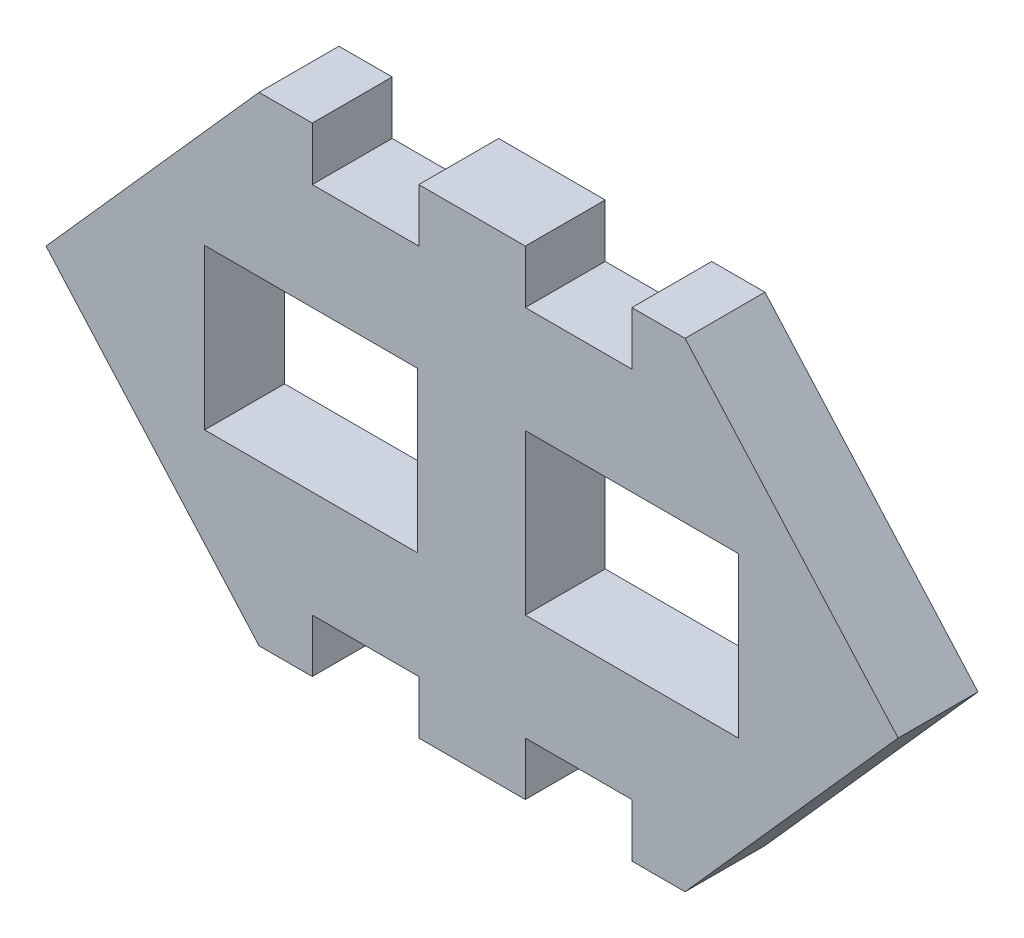
ISO-10303-21;
HEADER;
FILE_DESCRIPTION(('STEP AP214'),'2;1');
FILE_NAME('part.step','',(''),(''),'','','');
FILE_SCHEMA(('AUTOMOTIVE_DESIGN { 1 0 10303 214 1 1 1 1 }'));
ENDSEC;
DATA;
#1=APPLICATION_CONTEXT('core data for automotive mechanical design processes');
#2=APPLICATION_PROTOCOL_DEFINITION('international standard','automotive_design',2000,#1);
#3=PRODUCT_CONTEXT('',#1,'mechanical');
#4=PRODUCT('Part','Part','',(#3));
#5=PRODUCT_RELATED_PRODUCT_CATEGORY('part','',(#4));
#6=PRODUCT_DEFINITION_FORMATION('','',#4);
#7=PRODUCT_DEFINITION_CONTEXT('part definition',#1,'design');
#8=PRODUCT_DEFINITION('design','',#6,#7);
#9=PRODUCT_DEFINITION_SHAPE('','',#8);
#10=(LENGTH_UNIT() NAMED_UNIT(*) SI_UNIT(.MILLI.,.METRE.));
#11=(NAMED_UNIT(*) PLANE_ANGLE_UNIT() SI_UNIT($,.RADIAN.));
#12=(NAMED_UNIT(*) SI_UNIT($,.STERADIAN.) SOLID_ANGLE_UNIT());
#13=UNCERTAINTY_MEASURE_WITH_UNIT(LENGTH_MEASURE(1.E-05),#10,'distance_accuracy_value','');
#14=(GEOMETRIC_REPRESENTATION_CONTEXT(3) GLOBAL_UNCERTAINTY_ASSIGNED_CONTEXT((#13)) GLOBAL_UNIT_ASSIGNED_CONTEXT((#10,
#11,#12)) REPRESENTATION_CONTEXT('',''));
#15=CARTESIAN_POINT('',(0.,0.,0.));
#16=DIRECTION('',(0.,0.,1.));
#17=DIRECTION('',(1.,0.,0.));
#18=AXIS2_PLACEMENT_3D('',#15,#16,#17);
#19=CARTESIAN_POINT('',(0.,0.,38.1));
#20=DIRECTION('',(0.,0.,-1.));
#21=DIRECTION('',(-1.,0.,0.));
#22=AXIS2_PLACEMENT_3D('',#19,#20,#21);
#23=PLANE('',#22);
#24=DIRECTION('',(0.,-1.,0.));
#25=VECTOR('',#24,1.);
#26=CARTESIAN_POINT('',(228.6,38.1,38.1));
#27=LINE('',#26,#25);
#28=CARTESIAN_POINT('',(228.6,38.1,38.1));
#29=VERTEX_POINT('',#28);
#30=CARTESIAN_POINT('',(228.6,-38.1,38.1));
#31=VERTEX_POINT('',#30);
#32=EDGE_CURVE('E285',#29,#31,#27,.T.);
#33=ORIENTED_EDGE('',*,*,#32,.F.);
#34=DIRECTION('',(-1.,0.,0.));
#35=VECTOR('',#34,1.);
#36=CARTESIAN_POINT('',(228.6,38.1,38.1));
#37=LINE('',#36,#35);
#38=CARTESIAN_POINT('',(330.2,38.1,38.1));
#39=VERTEX_POINT('',#38);
#40=EDGE_CURVE('E296',#39,#29,#37,.T.);
#41=ORIENTED_EDGE('',*,*,#40,.F.);
#42=DIRECTION('',(0.,1.,0.));
#43=VECTOR('',#42,1.);
#44=CARTESIAN_POINT('',(330.2,38.1,38.1));
#45=LINE('',#44,#43);
#46=CARTESIAN_POINT('',(330.2,-38.1,38.1));
#47=VERTEX_POINT('',#46);
#48=EDGE_CURVE('E292',#47,#39,#45,.T.);
#49=ORIENTED_EDGE('',*,*,#48,.F.);
#50=DIRECTION('',(1.,0.,0.));
#51=VECTOR('',#50,1.);
#52=CARTESIAN_POINT('',(228.6,-38.1,38.1));
#53=LINE('',#52,#51);
#54=EDGE_CURVE('E288',#31,#47,#53,.T.);
#55=ORIENTED_EDGE('',*,*,#54,.F.);
#56=EDGE_LOOP('',(#33,#41,#49,#55));
#57=FACE_BOUND('',#56,.T.);
#58=DIRECTION('',(0.66436383882992,-0.74740931868366,0.));
#59=VECTOR('',#58,1.);
#60=CARTESIAN_POINT('',(101.6,-114.3,38.1));
#61=LINE('',#60,#59);
#62=CARTESIAN_POINT('',(0.,0.,38.1));
#63=VERTEX_POINT('',#62);
#64=CARTESIAN_POINT('',(101.6,-114.3,38.1));
#65=VERTEX_POINT('',#64);
#66=EDGE_CURVE('E328',#63,#65,#61,.T.);
#67=ORIENTED_EDGE('',*,*,#66,.T.);
#68=DIRECTION('',(1.,0.,0.));
#69=VECTOR('',#68,1.);
#70=CARTESIAN_POINT('',(127.,-114.3,38.1));
#71=LINE('',#70,#69);
#72=CARTESIAN_POINT('',(127.,-114.3,38.1));
#73=VERTEX_POINT('',#72);
#74=EDGE_CURVE('E332',#65,#73,#71,.T.);
#75=ORIENTED_EDGE('',*,*,#74,.T.);
#76=DIRECTION('',(0.,1.,0.));
#77=VECTOR('',#76,1.);
#78=CARTESIAN_POINT('',(127.,-88.9,38.1));
#79=LINE('',#78,#77);
#80=CARTESIAN_POINT('',(127.,-88.9,38.1));
#81=VERTEX_POINT('',#80);
#82=EDGE_CURVE('E336',#73,#81,#79,.T.);
#83=ORIENTED_EDGE('',*,*,#82,.T.);
#84=DIRECTION('',(1.,0.,0.));
#85=VECTOR('',#84,1.);
#86=CARTESIAN_POINT('',(177.8,-88.9,38.1));
#87=LINE('',#86,#85);
#88=CARTESIAN_POINT('',(177.8,-88.9,38.1));
#89=VERTEX_POINT('',#88);
#90=EDGE_CURVE('E339',#81,#89,#87,.T.);
#91=ORIENTED_EDGE('',*,*,#90,.T.);
#92=DIRECTION('',(0.,-1.,0.));
#93=VECTOR('',#92,1.);
#94=CARTESIAN_POINT('',(177.8,-114.3,38.1));
#95=LINE('',#94,#93);
#96=CARTESIAN_POINT('',(177.8,-114.3,38.1));
#97=VERTEX_POINT('',#96);
#98=EDGE_CURVE('E342',#89,#97,#95,.T.);
#99=ORIENTED_EDGE('',*,*,#98,.T.);
#100=DIRECTION('',(1.,0.,0.));
#101=VECTOR('',#100,1.);
#102=CARTESIAN_POINT('',(228.6,-114.3,38.1));
#103=LINE('',#102,#101);
#104=CARTESIAN_POINT('',(228.6,-114.3,38.1));
#105=VERTEX_POINT('',#104);
#106=EDGE_CURVE('E345',#97,#105,#103,.T.);
#107=ORIENTED_EDGE('',*,*,#106,.T.);
#108=DIRECTION('',(0.,1.,0.));
#109=VECTOR('',#108,1.);
#110=CARTESIAN_POINT('',(228.6,-88.8999999999999,38.1));
#111=LINE('',#110,#109);
#112=CARTESIAN_POINT('',(228.6,-88.8999999999999,38.1));
#113=VERTEX_POINT('',#112);
#114=EDGE_CURVE('E348',#105,#113,#111,.T.);
#115=ORIENTED_EDGE('',*,*,#114,.T.);
#116=DIRECTION('',(1.,0.,0.));
#117=VECTOR('',#116,1.);
#118=CARTESIAN_POINT('',(279.4,-88.8999999999998,38.1));
#119=LINE('',#118,#117);
#120=CARTESIAN_POINT('',(279.4,-88.8999999999998,38.1));
#121=VERTEX_POINT('',#120);
#122=EDGE_CURVE('E351',#113,#121,#119,.T.);
#123=ORIENTED_EDGE('',*,*,#122,.T.);
#124=DIRECTION('',(0.,-1.,0.));
#125=VECTOR('',#124,1.);
#126=CARTESIAN_POINT('',(279.4,-114.3,38.1));
#127=LINE('',#126,#125);
#128=CARTESIAN_POINT('',(279.4,-114.3,38.1));
#129=VERTEX_POINT('',#128);
#130=EDGE_CURVE('E354',#121,#129,#127,.T.);
#131=ORIENTED_EDGE('',*,*,#130,.T.);
#132=DIRECTION('',(1.,0.,0.));
#133=VECTOR('',#132,1.);
#134=CARTESIAN_POINT('',(304.8,-114.3,38.1));
#135=LINE('',#134,#133);
#136=CARTESIAN_POINT('',(304.8,-114.3,38.1));
#137=VERTEX_POINT('',#136);
#138=EDGE_CURVE('E357',#129,#137,#135,.T.);
#139=ORIENTED_EDGE('',*,*,#138,.T.);
#140=DIRECTION('',(0.66436383882992,0.74740931868366,0.));
#141=VECTOR('',#140,1.);
#142=CARTESIAN_POINT('',(406.4,0.,38.1));
#143=LINE('',#142,#141);
#144=CARTESIAN_POINT('',(406.4,0.,38.1));
#145=VERTEX_POINT('',#144);
#146=EDGE_CURVE('E360',#137,#145,#143,.T.);
#147=ORIENTED_EDGE('',*,*,#146,.T.);
#148=DIRECTION('',(-0.66436383882992,0.74740931868366,0.));
#149=VECTOR('',#148,1.);
#150=CARTESIAN_POINT('',(304.8,114.3,38.1));
#151=LINE('',#150,#149);
#152=CARTESIAN_POINT('',(304.8,114.3,38.1));
#153=VERTEX_POINT('',#152);
#154=EDGE_CURVE('E363',#145,#153,#151,.T.);
#155=ORIENTED_EDGE('',*,*,#154,.T.);
#156=DIRECTION('',(-1.,0.,0.));
#157=VECTOR('',#156,1.);
#158=CARTESIAN_POINT('',(279.4,114.3,38.1));
#159=LINE('',#158,#157);
#160=CARTESIAN_POINT('',(279.4,114.3,38.1));
#161=VERTEX_POINT('',#160);
#162=EDGE_CURVE('E366',#153,#161,#159,.T.);
#163=ORIENTED_EDGE('',*,*,#162,.T.);
#164=DIRECTION('',(0.,-1.,0.));
#165=VECTOR('',#164,1.);
#166=CARTESIAN_POINT('',(279.4,88.9,38.1));
#167=LINE('',#166,#165);
#168=CARTESIAN_POINT('',(279.4,88.9,38.1));
#169=VERTEX_POINT('',#168);
#170=EDGE_CURVE('E369',#161,#169,#167,.T.);
#171=ORIENTED_EDGE('',*,*,#170,.T.);
#172=DIRECTION('',(-1.,0.,0.));
#173=VECTOR('',#172,1.);
#174=CARTESIAN_POINT('',(228.6,88.9,38.1));
#175=LINE('',#174,#173);
#176=CARTESIAN_POINT('',(228.6,88.9,38.1));
#177=VERTEX_POINT('',#176);
#178=EDGE_CURVE('E372',#169,#177,#175,.T.);
#179=ORIENTED_EDGE('',*,*,#178,.T.);
#180=DIRECTION('',(0.,1.,0.));
#181=VECTOR('',#180,1.);
#182=CARTESIAN_POINT('',(228.6,114.3,38.1));
#183=LINE('',#182,#181);
#184=CARTESIAN_POINT('',(228.6,114.3,38.1));
#185=VERTEX_POINT('',#184);
#186=EDGE_CURVE('E375',#177,#185,#183,.T.);
#187=ORIENTED_EDGE('',*,*,#186,.T.);
#188=DIRECTION('',(-1.,0.,0.));
#189=VECTOR('',#188,1.);
#190=CARTESIAN_POINT('',(177.8,114.3,38.1));
#191=LINE('',#190,#189);
#192=CARTESIAN_POINT('',(177.8,114.3,38.1));
#193=VERTEX_POINT('',#192);
#194=EDGE_CURVE('E378',#185,#193,#191,.T.);
#195=ORIENTED_EDGE('',*,*,#194,.T.);
#196=DIRECTION('',(0.,-1.,0.));
#197=VECTOR('',#196,1.);
#198=CARTESIAN_POINT('',(177.8,88.9,38.1));
#199=LINE('',#198,#197);
#200=CARTESIAN_POINT('',(177.8,88.9,38.1));
#201=VERTEX_POINT('',#200);
#202=EDGE_CURVE('E381',#193,#201,#199,.T.);
#203=ORIENTED_EDGE('',*,*,#202,.T.);
#204=DIRECTION('',(-1.,0.,0.));
#205=VECTOR('',#204,1.);
#206=CARTESIAN_POINT('',(127.,88.9,38.1));
#207=LINE('',#206,#205);
#208=CARTESIAN_POINT('',(127.,88.9,38.1));
#209=VERTEX_POINT('',#208);
#210=EDGE_CURVE('E384',#201,#209,#207,.T.);
#211=ORIENTED_EDGE('',*,*,#210,.T.);
#212=DIRECTION('',(0.,1.,0.));
#213=VECTOR('',#212,1.);
#214=CARTESIAN_POINT('',(127.,114.3,38.1));
#215=LINE('',#214,#213);
#216=CARTESIAN_POINT('',(127.,114.3,38.1));
#217=VERTEX_POINT('',#216);
#218=EDGE_CURVE('E387',#209,#217,#215,.T.);
#219=ORIENTED_EDGE('',*,*,#218,.T.);
#220=DIRECTION('',(-1.,0.,0.));
#221=VECTOR('',#220,1.);
#222=CARTESIAN_POINT('',(101.6,114.3,38.1));
#223=LINE('',#222,#221);
#224=CARTESIAN_POINT('',(101.6,114.3,38.1));
#225=VERTEX_POINT('',#224);
#226=EDGE_CURVE('E390',#217,#225,#223,.T.);
#227=ORIENTED_EDGE('',*,*,#226,.T.);
#228=DIRECTION('',(-0.66436383882992,-0.74740931868366,0.));
#229=VECTOR('',#228,1.);
#230=CARTESIAN_POINT('',(0.,0.,38.1));
#231=LINE('',#230,#229);
#232=EDGE_CURVE('E393',#225,#63,#231,.T.);
#233=ORIENTED_EDGE('',*,*,#232,.T.);
#234=EDGE_LOOP('',(#67,#75,#83,#91,#99,#107,#115,#123,#131,#139,#147,#155,#163,#171,#179,#187,
#195,#203,#211,#219,#227,#233));
#235=FACE_BOUND('',#234,.T.);
#236=DIRECTION('',(0.,1.,0.));
#237=VECTOR('',#236,1.);
#238=CARTESIAN_POINT('',(177.283076324771,38.1,38.1));
#239=LINE('',#238,#237);
#240=CARTESIAN_POINT('',(177.283076324771,-38.1,38.1));
#241=VERTEX_POINT('',#240);
#242=CARTESIAN_POINT('',(177.283076324771,38.1,38.1));
#243=VERTEX_POINT('',#242);
#244=EDGE_CURVE('E237',#241,#243,#239,.T.);
#245=ORIENTED_EDGE('',*,*,#244,.F.);
#246=DIRECTION('',(1.,0.,0.));
#247=VECTOR('',#246,1.);
#248=CARTESIAN_POINT('',(177.283076324771,-38.1,38.1));
#249=LINE('',#248,#247);
#250=CARTESIAN_POINT('',(75.6830763247706,-38.1,38.1));
#251=VERTEX_POINT('',#250);
#252=EDGE_CURVE('E263',#251,#241,#249,.T.);
#253=ORIENTED_EDGE('',*,*,#252,.F.);
#254=DIRECTION('',(0.,-1.,0.));
#255=VECTOR('',#254,1.);
#256=CARTESIAN_POINT('',(75.6830763247706,38.1,38.1));
#257=LINE('',#256,#255);
#258=CARTESIAN_POINT('',(75.6830763247706,38.1,38.1));
#259=VERTEX_POINT('',#258);
#260=EDGE_CURVE('E259',#259,#251,#257,.T.);
#261=ORIENTED_EDGE('',*,*,#260,.F.);
#262=DIRECTION('',(-1.,0.,0.));
#263=VECTOR('',#262,1.);
#264=CARTESIAN_POINT('',(177.283076324771,38.1,38.1));
#265=LINE('',#264,#263);
#266=EDGE_CURVE('E246',#243,#259,#265,.T.);
#267=ORIENTED_EDGE('',*,*,#266,.F.);
#268=EDGE_LOOP('',(#245,#253,#261,#267));
#269=FACE_BOUND('',#268,.T.);
#270=ADVANCED_FACE('F39',(#57,#235,#269),#23,.F.);
#271=CARTESIAN_POINT('',(0.,0.,0.));
#272=DIRECTION('',(0.,0.,-1.));
#273=DIRECTION('',(-1.,0.,0.));
#274=AXIS2_PLACEMENT_3D('',#271,#272,#273);
#275=PLANE('',#274);
#276=DIRECTION('',(0.66436383882992,-0.74740931868366,0.));
#277=VECTOR('',#276,1.);
#278=CARTESIAN_POINT('',(101.6,-114.3,0.));
#279=LINE('',#278,#277);
#280=CARTESIAN_POINT('',(0.,0.,0.));
#281=VERTEX_POINT('',#280);
#282=CARTESIAN_POINT('',(101.6,-114.3,0.));
#283=VERTEX_POINT('',#282);
#284=EDGE_CURVE('E327',#281,#283,#279,.T.);
#285=ORIENTED_EDGE('',*,*,#284,.F.);
#286=DIRECTION('',(-0.66436383882992,-0.74740931868366,0.));
#287=VECTOR('',#286,1.);
#288=CARTESIAN_POINT('',(0.,0.,0.));
#289=LINE('',#288,#287);
#290=CARTESIAN_POINT('',(101.6,114.3,0.));
#291=VERTEX_POINT('',#290);
#292=EDGE_CURVE('E333',#291,#281,#289,.T.);
#293=ORIENTED_EDGE('',*,*,#292,.F.);
#294=DIRECTION('',(-1.,0.,0.));
#295=VECTOR('',#294,1.);
#296=CARTESIAN_POINT('',(101.6,114.3,0.));
#297=LINE('',#296,#295);
#298=CARTESIAN_POINT('',(127.,114.3,0.));
#299=VERTEX_POINT('',#298);
#300=EDGE_CURVE('E457',#299,#291,#297,.T.);
#301=ORIENTED_EDGE('',*,*,#300,.F.);
#302=DIRECTION('',(0.,1.,0.));
#303=VECTOR('',#302,1.);
#304=CARTESIAN_POINT('',(127.,114.3,0.));
#305=LINE('',#304,#303);
#306=CARTESIAN_POINT('',(127.,88.9,0.));
#307=VERTEX_POINT('',#306);
#308=EDGE_CURVE('E454',#307,#299,#305,.T.);
#309=ORIENTED_EDGE('',*,*,#308,.F.);
#310=DIRECTION('',(-1.,0.,0.));
#311=VECTOR('',#310,1.);
#312=CARTESIAN_POINT('',(127.,88.9,0.));
#313=LINE('',#312,#311);
#314=CARTESIAN_POINT('',(177.8,88.9,0.));
#315=VERTEX_POINT('',#314);
#316=EDGE_CURVE('E451',#315,#307,#313,.T.);
#317=ORIENTED_EDGE('',*,*,#316,.F.);
#318=DIRECTION('',(0.,-1.,0.));
#319=VECTOR('',#318,1.);
#320=CARTESIAN_POINT('',(177.8,88.9,0.));
#321=LINE('',#320,#319);
#322=CARTESIAN_POINT('',(177.8,114.3,0.));
#323=VERTEX_POINT('',#322);
#324=EDGE_CURVE('E448',#323,#315,#321,.T.);
#325=ORIENTED_EDGE('',*,*,#324,.F.);
#326=DIRECTION('',(-1.,0.,0.));
#327=VECTOR('',#326,1.);
#328=CARTESIAN_POINT('',(177.8,114.3,0.));
#329=LINE('',#328,#327);
#330=CARTESIAN_POINT('',(228.6,114.3,0.));
#331=VERTEX_POINT('',#330);
#332=EDGE_CURVE('E445',#331,#323,#329,.T.);
#333=ORIENTED_EDGE('',*,*,#332,.F.);
#334=DIRECTION('',(0.,1.,0.));
#335=VECTOR('',#334,1.);
#336=CARTESIAN_POINT('',(228.6,114.3,0.));
#337=LINE('',#336,#335);
#338=CARTESIAN_POINT('',(228.6,88.9,0.));
#339=VERTEX_POINT('',#338);
#340=EDGE_CURVE('E442',#339,#331,#337,.T.);
#341=ORIENTED_EDGE('',*,*,#340,.F.);
#342=DIRECTION('',(-1.,0.,0.));
#343=VECTOR('',#342,1.);
#344=CARTESIAN_POINT('',(228.6,88.9,0.));
#345=LINE('',#344,#343);
#346=CARTESIAN_POINT('',(279.4,88.9,0.));
#347=VERTEX_POINT('',#346);
#348=EDGE_CURVE('E439',#347,#339,#345,.T.);
#349=ORIENTED_EDGE('',*,*,#348,.F.);
#350=DIRECTION('',(0.,-1.,0.));
#351=VECTOR('',#350,1.);
#352=CARTESIAN_POINT('',(279.4,88.9,0.));
#353=LINE('',#352,#351);
#354=CARTESIAN_POINT('',(279.4,114.3,0.));
#355=VERTEX_POINT('',#354);
#356=EDGE_CURVE('E436',#355,#347,#353,.T.);
#357=ORIENTED_EDGE('',*,*,#356,.F.);
#358=DIRECTION('',(-1.,0.,0.));
#359=VECTOR('',#358,1.);
#360=CARTESIAN_POINT('',(279.4,114.3,0.));
#361=LINE('',#360,#359);
#362=CARTESIAN_POINT('',(304.8,114.3,0.));
#363=VERTEX_POINT('',#362);
#364=EDGE_CURVE('E433',#363,#355,#361,.T.);
#365=ORIENTED_EDGE('',*,*,#364,.F.);
#366=DIRECTION('',(-0.66436383882992,0.74740931868366,0.));
#367=VECTOR('',#366,1.);
#368=CARTESIAN_POINT('',(304.8,114.3,0.));
#369=LINE('',#368,#367);
#370=CARTESIAN_POINT('',(406.4,0.,0.));
#371=VERTEX_POINT('',#370);
#372=EDGE_CURVE('E430',#371,#363,#369,.T.);
#373=ORIENTED_EDGE('',*,*,#372,.F.);
#374=DIRECTION('',(0.66436383882992,0.74740931868366,0.));
#375=VECTOR('',#374,1.);
#376=CARTESIAN_POINT('',(406.4,0.,0.));
#377=LINE('',#376,#375);
#378=CARTESIAN_POINT('',(304.8,-114.3,0.));
#379=VERTEX_POINT('',#378);
#380=EDGE_CURVE('E427',#379,#371,#377,.T.);
#381=ORIENTED_EDGE('',*,*,#380,.F.);
#382=DIRECTION('',(1.,0.,0.));
#383=VECTOR('',#382,1.);
#384=CARTESIAN_POINT('',(304.8,-114.3,0.));
#385=LINE('',#384,#383);
#386=CARTESIAN_POINT('',(279.4,-114.3,0.));
#387=VERTEX_POINT('',#386);
#388=EDGE_CURVE('E424',#387,#379,#385,.T.);
#389=ORIENTED_EDGE('',*,*,#388,.F.);
#390=DIRECTION('',(0.,-1.,0.));
#391=VECTOR('',#390,1.);
#392=CARTESIAN_POINT('',(279.4,-114.3,0.));
#393=LINE('',#392,#391);
#394=CARTESIAN_POINT('',(279.4,-88.8999999999998,0.));
#395=VERTEX_POINT('',#394);
#396=EDGE_CURVE('E421',#395,#387,#393,.T.);
#397=ORIENTED_EDGE('',*,*,#396,.F.);
#398=DIRECTION('',(1.,0.,0.));
#399=VECTOR('',#398,1.);
#400=CARTESIAN_POINT('',(279.4,-88.8999999999998,0.));
#401=LINE('',#400,#399);
#402=CARTESIAN_POINT('',(228.6,-88.8999999999999,0.));
#403=VERTEX_POINT('',#402);
#404=EDGE_CURVE('E418',#403,#395,#401,.T.);
#405=ORIENTED_EDGE('',*,*,#404,.F.);
#406=DIRECTION('',(0.,1.,0.));
#407=VECTOR('',#406,1.);
#408=CARTESIAN_POINT('',(228.6,-88.8999999999999,0.));
#409=LINE('',#408,#407);
#410=CARTESIAN_POINT('',(228.6,-114.3,0.));
#411=VERTEX_POINT('',#410);
#412=EDGE_CURVE('E415',#411,#403,#409,.T.);
#413=ORIENTED_EDGE('',*,*,#412,.F.);
#414=DIRECTION('',(1.,0.,0.));
#415=VECTOR('',#414,1.);
#416=CARTESIAN_POINT('',(228.6,-114.3,0.));
#417=LINE('',#416,#415);
#418=CARTESIAN_POINT('',(177.8,-114.3,0.));
#419=VERTEX_POINT('',#418);
#420=EDGE_CURVE('E412',#419,#411,#417,.T.);
#421=ORIENTED_EDGE('',*,*,#420,.F.);
#422=DIRECTION('',(0.,-1.,0.));
#423=VECTOR('',#422,1.);
#424=CARTESIAN_POINT('',(177.8,-114.3,0.));
#425=LINE('',#424,#423);
#426=CARTESIAN_POINT('',(177.8,-88.9,0.));
#427=VERTEX_POINT('',#426);
#428=EDGE_CURVE('E409',#427,#419,#425,.T.);
#429=ORIENTED_EDGE('',*,*,#428,.F.);
#430=DIRECTION('',(1.,0.,0.));
#431=VECTOR('',#430,1.);
#432=CARTESIAN_POINT('',(177.8,-88.9,0.));
#433=LINE('',#432,#431);
#434=CARTESIAN_POINT('',(127.,-88.9,0.));
#435=VERTEX_POINT('',#434);
#436=EDGE_CURVE('E406',#435,#427,#433,.T.);
#437=ORIENTED_EDGE('',*,*,#436,.F.);
#438=DIRECTION('',(0.,1.,0.));
#439=VECTOR('',#438,1.);
#440=CARTESIAN_POINT('',(127.,-88.9,0.));
#441=LINE('',#440,#439);
#442=CARTESIAN_POINT('',(127.,-114.3,0.));
#443=VERTEX_POINT('',#442);
#444=EDGE_CURVE('E403',#443,#435,#441,.T.);
#445=ORIENTED_EDGE('',*,*,#444,.F.);
#446=DIRECTION('',(1.,0.,0.));
#447=VECTOR('',#446,1.);
#448=CARTESIAN_POINT('',(127.,-114.3,0.));
#449=LINE('',#448,#447);
#450=EDGE_CURVE('E400',#283,#443,#449,.T.);
#451=ORIENTED_EDGE('',*,*,#450,.F.);
#452=EDGE_LOOP('',(#285,#293,#301,#309,#317,#325,#333,#341,#349,#357,#365,#373,#381,#389,#397,
#405,#413,#421,#429,#437,#445,#451));
#453=FACE_BOUND('',#452,.T.);
#454=DIRECTION('',(-1.,0.,0.));
#455=VECTOR('',#454,1.);
#456=CARTESIAN_POINT('',(228.6,38.1,0.));
#457=LINE('',#456,#455);
#458=CARTESIAN_POINT('',(330.2,38.1,0.));
#459=VERTEX_POINT('',#458);
#460=CARTESIAN_POINT('',(228.6,38.1,0.));
#461=VERTEX_POINT('',#460);
#462=EDGE_CURVE('E289',#459,#461,#457,.T.);
#463=ORIENTED_EDGE('',*,*,#462,.T.);
#464=DIRECTION('',(0.,-1.,0.));
#465=VECTOR('',#464,1.);
#466=CARTESIAN_POINT('',(228.6,38.1,0.));
#467=LINE('',#466,#465);
#468=CARTESIAN_POINT('',(228.6,-38.1,0.));
#469=VERTEX_POINT('',#468);
#470=EDGE_CURVE('E255',#461,#469,#467,.T.);
#471=ORIENTED_EDGE('',*,*,#470,.T.);
#472=DIRECTION('',(1.,0.,0.));
#473=VECTOR('',#472,1.);
#474=CARTESIAN_POINT('',(228.6,-38.1,0.));
#475=LINE('',#474,#473);
#476=CARTESIAN_POINT('',(330.2,-38.1,0.));
#477=VERTEX_POINT('',#476);
#478=EDGE_CURVE('E303',#469,#477,#475,.T.);
#479=ORIENTED_EDGE('',*,*,#478,.T.);
#480=DIRECTION('',(0.,1.,0.));
#481=VECTOR('',#480,1.);
#482=CARTESIAN_POINT('',(330.2,38.1,0.));
#483=LINE('',#482,#481);
#484=EDGE_CURVE('E307',#477,#459,#483,.T.);
#485=ORIENTED_EDGE('',*,*,#484,.T.);
#486=EDGE_LOOP('',(#463,#471,#479,#485));
#487=FACE_BOUND('',#486,.T.);
#488=DIRECTION('',(1.,0.,0.));
#489=VECTOR('',#488,1.);
#490=CARTESIAN_POINT('',(177.283076324771,-38.1,0.));
#491=LINE('',#490,#489);
#492=CARTESIAN_POINT('',(75.6830763247706,-38.1,0.));
#493=VERTEX_POINT('',#492);
#494=CARTESIAN_POINT('',(177.283076324771,-38.1,0.));
#495=VERTEX_POINT('',#494);
#496=EDGE_CURVE('E247',#493,#495,#491,.T.);
#497=ORIENTED_EDGE('',*,*,#496,.T.);
#498=DIRECTION('',(0.,1.,0.));
#499=VECTOR('',#498,1.);
#500=CARTESIAN_POINT('',(177.283076324771,38.1,0.));
#501=LINE('',#500,#499);
#502=CARTESIAN_POINT('',(177.283076324771,38.1,0.));
#503=VERTEX_POINT('',#502);
#504=EDGE_CURVE('E63',#495,#503,#501,.T.);
#505=ORIENTED_EDGE('',*,*,#504,.T.);
#506=DIRECTION('',(-1.,0.,0.));
#507=VECTOR('',#506,1.);
#508=CARTESIAN_POINT('',(177.283076324771,38.1,0.));
#509=LINE('',#508,#507);
#510=CARTESIAN_POINT('',(75.6830763247706,38.1,0.));
#511=VERTEX_POINT('',#510);
#512=EDGE_CURVE('E253',#503,#511,#509,.T.);
#513=ORIENTED_EDGE('',*,*,#512,.T.);
#514=DIRECTION('',(0.,-1.,0.));
#515=VECTOR('',#514,1.);
#516=CARTESIAN_POINT('',(75.6830763247706,38.1,0.));
#517=LINE('',#516,#515);
#518=EDGE_CURVE('E272',#511,#493,#517,.T.);
#519=ORIENTED_EDGE('',*,*,#518,.T.);
#520=EDGE_LOOP('',(#497,#505,#513,#519));
#521=FACE_BOUND('',#520,.T.);
#522=ADVANCED_FACE('F552',(#453,#487,#521),#275,.T.);
#523=CARTESIAN_POINT('',(101.6,-114.3,38.1));
#524=DIRECTION('',(0.74740931868366,0.66436383882992,0.));
#525=DIRECTION('',(-0.66436383882992,0.74740931868366,0.));
#526=AXIS2_PLACEMENT_3D('',#523,#524,#525);
#527=PLANE('',#526);
#528=ORIENTED_EDGE('',*,*,#284,.T.);
#529=DIRECTION('',(0.,0.,-1.));
#530=VECTOR('',#529,1.);
#531=CARTESIAN_POINT('',(101.6,-114.3,38.1));
#532=LINE('',#531,#530);
#533=EDGE_CURVE('E11',#65,#283,#532,.T.);
#534=ORIENTED_EDGE('',*,*,#533,.F.);
#535=ORIENTED_EDGE('',*,*,#66,.F.);
#536=DIRECTION('',(0.,0.,-1.));
#537=VECTOR('',#536,1.);
#538=CARTESIAN_POINT('',(0.,0.,38.1));
#539=LINE('',#538,#537);
#540=EDGE_CURVE('E396',#63,#281,#539,.T.);
#541=ORIENTED_EDGE('',*,*,#540,.T.);
#542=EDGE_LOOP('',(#528,#534,#535,#541));
#543=FACE_BOUND('',#542,.T.);
#544=ADVANCED_FACE('F41',(#543),#527,.F.);
#545=CARTESIAN_POINT('',(127.,-114.3,38.1));
#546=DIRECTION('',(0.,1.,0.));
#547=DIRECTION('',(0.,0.,1.));
#548=AXIS2_PLACEMENT_3D('',#545,#546,#547);
#549=PLANE('',#548);
#550=ORIENTED_EDGE('',*,*,#450,.T.);
#551=DIRECTION('',(0.,0.,-1.));
#552=VECTOR('',#551,1.);
#553=CARTESIAN_POINT('',(127.,-114.3,38.1));
#554=LINE('',#553,#552);
#555=EDGE_CURVE('E48',#73,#443,#554,.T.);
#556=ORIENTED_EDGE('',*,*,#555,.F.);
#557=ORIENTED_EDGE('',*,*,#74,.F.);
#558=ORIENTED_EDGE('',*,*,#533,.T.);
#559=EDGE_LOOP('',(#550,#556,#557,#558));
#560=FACE_BOUND('',#559,.T.);
#561=ADVANCED_FACE('F569',(#560),#549,.F.);
#562=CARTESIAN_POINT('',(127.,-88.9,38.1));
#563=DIRECTION('',(-1.,0.,0.));
#564=DIRECTION('',(0.,0.,1.));
#565=AXIS2_PLACEMENT_3D('',#562,#563,#564);
#566=PLANE('',#565);
#567=ORIENTED_EDGE('',*,*,#444,.T.);
#568=DIRECTION('',(0.,0.,-1.));
#569=VECTOR('',#568,1.);
#570=CARTESIAN_POINT('',(127.,-88.9,38.1));
#571=LINE('',#570,#569);
#572=EDGE_CURVE('E537',#81,#435,#571,.T.);
#573=ORIENTED_EDGE('',*,*,#572,.F.);
#574=ORIENTED_EDGE('',*,*,#82,.F.);
#575=ORIENTED_EDGE('',*,*,#555,.T.);
#576=EDGE_LOOP('',(#567,#573,#574,#575));
#577=FACE_BOUND('',#576,.T.);
#578=ADVANCED_FACE('F546',(#577),#566,.F.);
#579=CARTESIAN_POINT('',(177.8,-88.9,38.1));
#580=DIRECTION('',(0.,1.,0.));
#581=DIRECTION('',(0.,0.,1.));
#582=AXIS2_PLACEMENT_3D('',#579,#580,#581);
#583=PLANE('',#582);
#584=ORIENTED_EDGE('',*,*,#436,.T.);
#585=DIRECTION('',(0.,0.,-1.));
#586=VECTOR('',#585,1.);
#587=CARTESIAN_POINT('',(177.8,-88.9,38.1));
#588=LINE('',#587,#586);
#589=EDGE_CURVE('E533',#89,#427,#588,.T.);
#590=ORIENTED_EDGE('',*,*,#589,.F.);
#591=ORIENTED_EDGE('',*,*,#90,.F.);
#592=ORIENTED_EDGE('',*,*,#572,.T.);
#593=EDGE_LOOP('',(#584,#590,#591,#592));
#594=FACE_BOUND('',#593,.T.);
#595=ADVANCED_FACE('F558',(#594),#583,.F.);
#596=CARTESIAN_POINT('',(177.8,-114.3,38.1));
#597=DIRECTION('',(1.,0.,0.));
#598=DIRECTION('',(0.,1.,0.));
#599=AXIS2_PLACEMENT_3D('',#596,#597,#598);
#600=PLANE('',#599);
#601=ORIENTED_EDGE('',*,*,#428,.T.);
#602=DIRECTION('',(0.,0.,-1.));
#603=VECTOR('',#602,1.);
#604=CARTESIAN_POINT('',(177.8,-114.3,38.1));
#605=LINE('',#604,#603);
#606=EDGE_CURVE('E529',#97,#419,#605,.T.);
#607=ORIENTED_EDGE('',*,*,#606,.F.);
#608=ORIENTED_EDGE('',*,*,#98,.F.);
#609=ORIENTED_EDGE('',*,*,#589,.T.);
#610=EDGE_LOOP('',(#601,#607,#608,#609));
#611=FACE_BOUND('',#610,.T.);
#612=ADVANCED_FACE('F562',(#611),#600,.F.);
#613=CARTESIAN_POINT('',(228.6,-114.3,38.1));
#614=DIRECTION('',(0.,1.,0.));
#615=DIRECTION('',(-1.,0.,0.));
#616=AXIS2_PLACEMENT_3D('',#613,#614,#615);
#617=PLANE('',#616);
#618=ORIENTED_EDGE('',*,*,#420,.T.);
#619=DIRECTION('',(0.,0.,-1.));
#620=VECTOR('',#619,1.);
#621=CARTESIAN_POINT('',(228.6,-114.3,38.1));
#622=LINE('',#621,#620);
#623=EDGE_CURVE('E525',#105,#411,#622,.T.);
#624=ORIENTED_EDGE('',*,*,#623,.F.);
#625=ORIENTED_EDGE('',*,*,#106,.F.);
#626=ORIENTED_EDGE('',*,*,#606,.T.);
#627=EDGE_LOOP('',(#618,#624,#625,#626));
#628=FACE_BOUND('',#627,.T.);
#629=ADVANCED_FACE('F652',(#628),#617,.F.);
#630=CARTESIAN_POINT('',(228.6,-88.8999999999999,38.1));
#631=DIRECTION('',(-1.,0.,0.));
#632=DIRECTION('',(0.,0.,1.));
#633=AXIS2_PLACEMENT_3D('',#630,#631,#632);
#634=PLANE('',#633);
#635=ORIENTED_EDGE('',*,*,#412,.T.);
#636=DIRECTION('',(0.,0.,-1.));
#637=VECTOR('',#636,1.);
#638=CARTESIAN_POINT('',(228.6,-88.8999999999999,38.1));
#639=LINE('',#638,#637);
#640=EDGE_CURVE('E521',#113,#403,#639,.T.);
#641=ORIENTED_EDGE('',*,*,#640,.F.);
#642=ORIENTED_EDGE('',*,*,#114,.F.);
#643=ORIENTED_EDGE('',*,*,#623,.T.);
#644=EDGE_LOOP('',(#635,#641,#642,#643));
#645=FACE_BOUND('',#644,.T.);
#646=ADVANCED_FACE('F649',(#645),#634,.F.);
#647=CARTESIAN_POINT('',(279.4,-88.8999999999998,38.1));
#648=DIRECTION('',(0.,1.,0.));
#649=DIRECTION('',(-1.,0.,0.));
#650=AXIS2_PLACEMENT_3D('',#647,#648,#649);
#651=PLANE('',#650);
#652=ORIENTED_EDGE('',*,*,#404,.T.);
#653=DIRECTION('',(0.,0.,-1.));
#654=VECTOR('',#653,1.);
#655=CARTESIAN_POINT('',(279.4,-88.8999999999998,38.1));
#656=LINE('',#655,#654);
#657=EDGE_CURVE('E517',#121,#395,#656,.T.);
#658=ORIENTED_EDGE('',*,*,#657,.F.);
#659=ORIENTED_EDGE('',*,*,#122,.F.);
#660=ORIENTED_EDGE('',*,*,#640,.T.);
#661=EDGE_LOOP('',(#652,#658,#659,#660));
#662=FACE_BOUND('',#661,.T.);
#663=ADVANCED_FACE('F645',(#662),#651,.F.);
#664=CARTESIAN_POINT('',(279.4,-114.3,38.1));
#665=DIRECTION('',(1.,0.,0.));
#666=DIRECTION('',(0.,0.,-1.));
#667=AXIS2_PLACEMENT_3D('',#664,#665,#666);
#668=PLANE('',#667);
#669=ORIENTED_EDGE('',*,*,#396,.T.);
#670=DIRECTION('',(0.,0.,-1.));
#671=VECTOR('',#670,1.);
#672=CARTESIAN_POINT('',(279.4,-114.3,38.1));
#673=LINE('',#672,#671);
#674=EDGE_CURVE('E513',#129,#387,#673,.T.);
#675=ORIENTED_EDGE('',*,*,#674,.F.);
#676=ORIENTED_EDGE('',*,*,#130,.F.);
#677=ORIENTED_EDGE('',*,*,#657,.T.);
#678=EDGE_LOOP('',(#669,#675,#676,#677));
#679=FACE_BOUND('',#678,.T.);
#680=ADVANCED_FACE('F641',(#679),#668,.F.);
#681=CARTESIAN_POINT('',(304.8,-114.3,38.1));
#682=DIRECTION('',(0.,1.,0.));
#683=DIRECTION('',(-1.,0.,0.));
#684=AXIS2_PLACEMENT_3D('',#681,#682,#683);
#685=PLANE('',#684);
#686=ORIENTED_EDGE('',*,*,#388,.T.);
#687=DIRECTION('',(0.,0.,-1.));
#688=VECTOR('',#687,1.);
#689=CARTESIAN_POINT('',(304.8,-114.3,38.1));
#690=LINE('',#689,#688);
#691=EDGE_CURVE('E509',#137,#379,#690,.T.);
#692=ORIENTED_EDGE('',*,*,#691,.F.);
#693=ORIENTED_EDGE('',*,*,#138,.F.);
#694=ORIENTED_EDGE('',*,*,#674,.T.);
#695=EDGE_LOOP('',(#686,#692,#693,#694));
#696=FACE_BOUND('',#695,.T.);
#697=ADVANCED_FACE('F636',(#696),#685,.F.);
#698=CARTESIAN_POINT('',(406.4,0.,38.1));
#699=DIRECTION('',(-0.74740931868366,0.66436383882992,0.));
#700=DIRECTION('',(-0.66436383882992,-0.74740931868366,0.));
#701=AXIS2_PLACEMENT_3D('',#698,#699,#700);
#702=PLANE('',#701);
#703=ORIENTED_EDGE('',*,*,#380,.T.);
#704=DIRECTION('',(0.,0.,-1.));
#705=VECTOR('',#704,1.);
#706=CARTESIAN_POINT('',(406.4,0.,38.1));
#707=LINE('',#706,#705);
#708=EDGE_CURVE('E505',#145,#371,#707,.T.);
#709=ORIENTED_EDGE('',*,*,#708,.F.);
#710=ORIENTED_EDGE('',*,*,#146,.F.);
#711=ORIENTED_EDGE('',*,*,#691,.T.);
#712=EDGE_LOOP('',(#703,#709,#710,#711));
#713=FACE_BOUND('',#712,.T.);
#714=ADVANCED_FACE('F630',(#713),#702,.F.);
#715=CARTESIAN_POINT('',(304.8,114.3,38.1));
#716=DIRECTION('',(-0.74740931868366,-0.66436383882992,0.));
#717=DIRECTION('',(0.66436383882992,-0.74740931868366,0.));
#718=AXIS2_PLACEMENT_3D('',#715,#716,#717);
#719=PLANE('',#718);
#720=ORIENTED_EDGE('',*,*,#372,.T.);
#721=DIRECTION('',(0.,0.,-1.));
#722=VECTOR('',#721,1.);
#723=CARTESIAN_POINT('',(304.8,114.3,38.1));
#724=LINE('',#723,#722);
#725=EDGE_CURVE('E501',#153,#363,#724,.T.);
#726=ORIENTED_EDGE('',*,*,#725,.F.);
#727=ORIENTED_EDGE('',*,*,#154,.F.);
#728=ORIENTED_EDGE('',*,*,#708,.T.);
#729=EDGE_LOOP('',(#720,#726,#727,#728));
#730=FACE_BOUND('',#729,.T.);
#731=ADVANCED_FACE('F626',(#730),#719,.F.);
#732=CARTESIAN_POINT('',(279.4,114.3,38.1));
#733=DIRECTION('',(0.,-1.,0.));
#734=DIRECTION('',(0.,0.,-1.));
#735=AXIS2_PLACEMENT_3D('',#732,#733,#734);
#736=PLANE('',#735);
#737=ORIENTED_EDGE('',*,*,#364,.T.);
#738=DIRECTION('',(0.,0.,-1.));
#739=VECTOR('',#738,1.);
#740=CARTESIAN_POINT('',(279.4,114.3,38.1));
#741=LINE('',#740,#739);
#742=EDGE_CURVE('E497',#161,#355,#741,.T.);
#743=ORIENTED_EDGE('',*,*,#742,.F.);
#744=ORIENTED_EDGE('',*,*,#162,.F.);
#745=ORIENTED_EDGE('',*,*,#725,.T.);
#746=EDGE_LOOP('',(#737,#743,#744,#745));
#747=FACE_BOUND('',#746,.T.);
#748=ADVANCED_FACE('F621',(#747),#736,.F.);
#749=CARTESIAN_POINT('',(279.4,88.9,38.1));
#750=DIRECTION('',(1.,0.,0.));
#751=DIRECTION('',(0.,0.,-1.));
#752=AXIS2_PLACEMENT_3D('',#749,#750,#751);
#753=PLANE('',#752);
#754=ORIENTED_EDGE('',*,*,#356,.T.);
#755=DIRECTION('',(0.,0.,-1.));
#756=VECTOR('',#755,1.);
#757=CARTESIAN_POINT('',(279.4,88.9,38.1));
#758=LINE('',#757,#756);
#759=EDGE_CURVE('E493',#169,#347,#758,.T.);
#760=ORIENTED_EDGE('',*,*,#759,.F.);
#761=ORIENTED_EDGE('',*,*,#170,.F.);
#762=ORIENTED_EDGE('',*,*,#742,.T.);
#763=EDGE_LOOP('',(#754,#760,#761,#762));
#764=FACE_BOUND('',#763,.T.);
#765=ADVANCED_FACE('F615',(#764),#753,.F.);
#766=CARTESIAN_POINT('',(228.6,88.9,38.1));
#767=DIRECTION('',(0.,-1.,0.));
#768=DIRECTION('',(0.,0.,-1.));
#769=AXIS2_PLACEMENT_3D('',#766,#767,#768);
#770=PLANE('',#769);
#771=ORIENTED_EDGE('',*,*,#348,.T.);
#772=DIRECTION('',(0.,0.,-1.));
#773=VECTOR('',#772,1.);
#774=CARTESIAN_POINT('',(228.6,88.9,38.1));
#775=LINE('',#774,#773);
#776=EDGE_CURVE('E489',#177,#339,#775,.T.);
#777=ORIENTED_EDGE('',*,*,#776,.F.);
#778=ORIENTED_EDGE('',*,*,#178,.F.);
#779=ORIENTED_EDGE('',*,*,#759,.T.);
#780=EDGE_LOOP('',(#771,#777,#778,#779));
#781=FACE_BOUND('',#780,.T.);
#782=ADVANCED_FACE('F611',(#781),#770,.F.);
#783=CARTESIAN_POINT('',(228.6,114.3,38.1));
#784=DIRECTION('',(-1.,0.,0.));
#785=DIRECTION('',(0.,-1.,0.));
#786=AXIS2_PLACEMENT_3D('',#783,#784,#785);
#787=PLANE('',#786);
#788=ORIENTED_EDGE('',*,*,#340,.T.);
#789=DIRECTION('',(0.,0.,-1.));
#790=VECTOR('',#789,1.);
#791=CARTESIAN_POINT('',(228.6,114.3,38.1));
#792=LINE('',#791,#790);
#793=EDGE_CURVE('E485',#185,#331,#792,.T.);
#794=ORIENTED_EDGE('',*,*,#793,.F.);
#795=ORIENTED_EDGE('',*,*,#186,.F.);
#796=ORIENTED_EDGE('',*,*,#776,.T.);
#797=EDGE_LOOP('',(#788,#794,#795,#796));
#798=FACE_BOUND('',#797,.T.);
#799=ADVANCED_FACE('F606',(#798),#787,.F.);
#800=CARTESIAN_POINT('',(177.8,114.3,38.1));
#801=DIRECTION('',(0.,-1.,0.));
#802=DIRECTION('',(0.,0.,-1.));
#803=AXIS2_PLACEMENT_3D('',#800,#801,#802);
#804=PLANE('',#803);
#805=ORIENTED_EDGE('',*,*,#332,.T.);
#806=DIRECTION('',(0.,0.,-1.));
#807=VECTOR('',#806,1.);
#808=CARTESIAN_POINT('',(177.8,114.3,38.1));
#809=LINE('',#808,#807);
#810=EDGE_CURVE('E481',#193,#323,#809,.T.);
#811=ORIENTED_EDGE('',*,*,#810,.F.);
#812=ORIENTED_EDGE('',*,*,#194,.F.);
#813=ORIENTED_EDGE('',*,*,#793,.T.);
#814=EDGE_LOOP('',(#805,#811,#812,#813));
#815=FACE_BOUND('',#814,.T.);
#816=ADVANCED_FACE('F600',(#815),#804,.F.);
#817=CARTESIAN_POINT('',(177.8,88.9,38.1));
#818=DIRECTION('',(1.,0.,0.));
#819=DIRECTION('',(0.,0.,-1.));
#820=AXIS2_PLACEMENT_3D('',#817,#818,#819);
#821=PLANE('',#820);
#822=ORIENTED_EDGE('',*,*,#324,.T.);
#823=DIRECTION('',(0.,0.,-1.));
#824=VECTOR('',#823,1.);
#825=CARTESIAN_POINT('',(177.8,88.9,38.1));
#826=LINE('',#825,#824);
#827=EDGE_CURVE('E477',#201,#315,#826,.T.);
#828=ORIENTED_EDGE('',*,*,#827,.F.);
#829=ORIENTED_EDGE('',*,*,#202,.F.);
#830=ORIENTED_EDGE('',*,*,#810,.T.);
#831=EDGE_LOOP('',(#822,#828,#829,#830));
#832=FACE_BOUND('',#831,.T.);
#833=ADVANCED_FACE('F596',(#832),#821,.F.);
#834=CARTESIAN_POINT('',(127.,88.9,38.1));
#835=DIRECTION('',(0.,-1.,0.));
#836=DIRECTION('',(1.,0.,0.));
#837=AXIS2_PLACEMENT_3D('',#834,#835,#836);
#838=PLANE('',#837);
#839=ORIENTED_EDGE('',*,*,#316,.T.);
#840=DIRECTION('',(0.,0.,-1.));
#841=VECTOR('',#840,1.);
#842=CARTESIAN_POINT('',(127.,88.9,38.1));
#843=LINE('',#842,#841);
#844=EDGE_CURVE('E473',#209,#307,#843,.T.);
#845=ORIENTED_EDGE('',*,*,#844,.F.);
#846=ORIENTED_EDGE('',*,*,#210,.F.);
#847=ORIENTED_EDGE('',*,*,#827,.T.);
#848=EDGE_LOOP('',(#839,#845,#846,#847));
#849=FACE_BOUND('',#848,.T.);
#850=ADVANCED_FACE('F591',(#849),#838,.F.);
#851=CARTESIAN_POINT('',(127.,114.3,38.1));
#852=DIRECTION('',(-1.,0.,0.));
#853=DIRECTION('',(0.,-1.,0.));
#854=AXIS2_PLACEMENT_3D('',#851,#852,#853);
#855=PLANE('',#854);
#856=ORIENTED_EDGE('',*,*,#308,.T.);
#857=DIRECTION('',(0.,0.,-1.));
#858=VECTOR('',#857,1.);
#859=CARTESIAN_POINT('',(127.,114.3,38.1));
#860=LINE('',#859,#858);
#861=EDGE_CURVE('E469',#217,#299,#860,.T.);
#862=ORIENTED_EDGE('',*,*,#861,.F.);
#863=ORIENTED_EDGE('',*,*,#218,.F.);
#864=ORIENTED_EDGE('',*,*,#844,.T.);
#865=EDGE_LOOP('',(#856,#862,#863,#864));
#866=FACE_BOUND('',#865,.T.);
#867=ADVANCED_FACE('F585',(#866),#855,.F.);
#868=CARTESIAN_POINT('',(101.6,114.3,38.1));
#869=DIRECTION('',(0.,-1.,0.));
#870=DIRECTION('',(1.,0.,0.));
#871=AXIS2_PLACEMENT_3D('',#868,#869,#870);
#872=PLANE('',#871);
#873=ORIENTED_EDGE('',*,*,#300,.T.);
#874=DIRECTION('',(0.,0.,-1.));
#875=VECTOR('',#874,1.);
#876=CARTESIAN_POINT('',(101.6,114.3,38.1));
#877=LINE('',#876,#875);
#878=EDGE_CURVE('E465',#225,#291,#877,.T.);
#879=ORIENTED_EDGE('',*,*,#878,.F.);
#880=ORIENTED_EDGE('',*,*,#226,.F.);
#881=ORIENTED_EDGE('',*,*,#861,.T.);
#882=EDGE_LOOP('',(#873,#879,#880,#881));
#883=FACE_BOUND('',#882,.T.);
#884=ADVANCED_FACE('F581',(#883),#872,.F.);
#885=CARTESIAN_POINT('',(0.,0.,38.1));
#886=DIRECTION('',(0.74740931868366,-0.66436383882992,0.));
#887=DIRECTION('',(0.66436383882992,0.74740931868366,0.));
#888=AXIS2_PLACEMENT_3D('',#885,#886,#887);
#889=PLANE('',#888);
#890=ORIENTED_EDGE('',*,*,#292,.T.);
#891=ORIENTED_EDGE('',*,*,#540,.F.);
#892=ORIENTED_EDGE('',*,*,#232,.F.);
#893=ORIENTED_EDGE('',*,*,#878,.T.);
#894=EDGE_LOOP('',(#890,#891,#892,#893));
#895=FACE_BOUND('',#894,.T.);
#896=ADVANCED_FACE('F576',(#895),#889,.F.);
#897=CARTESIAN_POINT('',(228.6,38.1,38.1));
#898=DIRECTION('',(1.,0.,0.));
#899=DIRECTION('',(0.,0.,-1.));
#900=AXIS2_PLACEMENT_3D('',#897,#898,#899);
#901=PLANE('',#900);
#902=ORIENTED_EDGE('',*,*,#470,.F.);
#903=DIRECTION('',(0.,0.,-1.));
#904=VECTOR('',#903,1.);
#905=CARTESIAN_POINT('',(228.6,38.1,38.1));
#906=LINE('',#905,#904);
#907=EDGE_CURVE('E299',#29,#461,#906,.T.);
#908=ORIENTED_EDGE('',*,*,#907,.F.);
#909=ORIENTED_EDGE('',*,*,#32,.T.);
#910=DIRECTION('',(0.,0.,-1.));
#911=VECTOR('',#910,1.);
#912=CARTESIAN_POINT('',(228.6,-38.1,38.1));
#913=LINE('',#912,#911);
#914=EDGE_CURVE('E323',#31,#469,#913,.T.);
#915=ORIENTED_EDGE('',*,*,#914,.T.);
#916=EDGE_LOOP('',(#902,#908,#909,#915));
#917=FACE_BOUND('',#916,.T.);
#918=ADVANCED_FACE('F670',(#917),#901,.T.);
#919=CARTESIAN_POINT('',(228.6,-38.1,38.1));
#920=DIRECTION('',(0.,1.,0.));
#921=DIRECTION('',(0.,0.,1.));
#922=AXIS2_PLACEMENT_3D('',#919,#920,#921);
#923=PLANE('',#922);
#924=ORIENTED_EDGE('',*,*,#478,.F.);
#925=ORIENTED_EDGE('',*,*,#914,.F.);
#926=ORIENTED_EDGE('',*,*,#54,.T.);
#927=DIRECTION('',(0.,0.,-1.));
#928=VECTOR('',#927,1.);
#929=CARTESIAN_POINT('',(330.2,-38.1,38.1));
#930=LINE('',#929,#928);
#931=EDGE_CURVE('E320',#47,#477,#930,.T.);
#932=ORIENTED_EDGE('',*,*,#931,.T.);
#933=EDGE_LOOP('',(#924,#925,#926,#932));
#934=FACE_BOUND('',#933,.T.);
#935=ADVANCED_FACE('F768',(#934),#923,.T.);
#936=CARTESIAN_POINT('',(330.2,38.1,38.1));
#937=DIRECTION('',(-1.,0.,0.));
#938=DIRECTION('',(0.,0.,1.));
#939=AXIS2_PLACEMENT_3D('',#936,#937,#938);
#940=PLANE('',#939);
#941=ORIENTED_EDGE('',*,*,#484,.F.);
#942=ORIENTED_EDGE('',*,*,#931,.F.);
#943=ORIENTED_EDGE('',*,*,#48,.T.);
#944=DIRECTION('',(0.,0.,-1.));
#945=VECTOR('',#944,1.);
#946=CARTESIAN_POINT('',(330.2,38.1,38.1));
#947=LINE('',#946,#945);
#948=EDGE_CURVE('E317',#39,#459,#947,.T.);
#949=ORIENTED_EDGE('',*,*,#948,.T.);
#950=EDGE_LOOP('',(#941,#942,#943,#949));
#951=FACE_BOUND('',#950,.T.);
#952=ADVANCED_FACE('F775',(#951),#940,.T.);
#953=CARTESIAN_POINT('',(228.6,38.1,38.1));
#954=DIRECTION('',(0.,-1.,0.));
#955=DIRECTION('',(0.,0.,-1.));
#956=AXIS2_PLACEMENT_3D('',#953,#954,#955);
#957=PLANE('',#956);
#958=ORIENTED_EDGE('',*,*,#462,.F.);
#959=ORIENTED_EDGE('',*,*,#948,.F.);
#960=ORIENTED_EDGE('',*,*,#40,.T.);
#961=ORIENTED_EDGE('',*,*,#907,.T.);
#962=EDGE_LOOP('',(#958,#959,#960,#961));
#963=FACE_BOUND('',#962,.T.);
#964=ADVANCED_FACE('F782',(#963),#957,.T.);
#965=CARTESIAN_POINT('',(177.283076324771,38.1,38.1));
#966=DIRECTION('',(-1.,0.,0.));
#967=DIRECTION('',(0.,0.,1.));
#968=AXIS2_PLACEMENT_3D('',#965,#966,#967);
#969=PLANE('',#968);
#970=ORIENTED_EDGE('',*,*,#504,.F.);
#971=DIRECTION('',(0.,0.,-1.));
#972=VECTOR('',#971,1.);
#973=CARTESIAN_POINT('',(177.283076324771,-38.1,38.1));
#974=LINE('',#973,#972);
#975=EDGE_CURVE('E241',#241,#495,#974,.T.);
#976=ORIENTED_EDGE('',*,*,#975,.F.);
#977=ORIENTED_EDGE('',*,*,#244,.T.);
#978=DIRECTION('',(0.,0.,-1.));
#979=VECTOR('',#978,1.);
#980=CARTESIAN_POINT('',(177.283076324771,38.1,38.1));
#981=LINE('',#980,#979);
#982=EDGE_CURVE('E240',#243,#503,#981,.T.);
#983=ORIENTED_EDGE('',*,*,#982,.T.);
#984=EDGE_LOOP('',(#970,#976,#977,#983));
#985=FACE_BOUND('',#984,.T.);
#986=ADVANCED_FACE('F239',(#985),#969,.T.);
#987=CARTESIAN_POINT('',(177.283076324771,38.1,38.1));
#988=DIRECTION('',(0.,-1.,0.));
#989=DIRECTION('',(1.,0.,0.));
#990=AXIS2_PLACEMENT_3D('',#987,#988,#989);
#991=PLANE('',#990);
#992=ORIENTED_EDGE('',*,*,#512,.F.);
#993=ORIENTED_EDGE('',*,*,#982,.F.);
#994=ORIENTED_EDGE('',*,*,#266,.T.);
#995=DIRECTION('',(0.,0.,-1.));
#996=VECTOR('',#995,1.);
#997=CARTESIAN_POINT('',(75.6830763247706,38.1,38.1));
#998=LINE('',#997,#996);
#999=EDGE_CURVE('E256',#259,#511,#998,.T.);
#1000=ORIENTED_EDGE('',*,*,#999,.T.);
#1001=EDGE_LOOP('',(#992,#993,#994,#1000));
#1002=FACE_BOUND('',#1001,.T.);
#1003=ADVANCED_FACE('F250',(#1002),#991,.T.);
#1004=CARTESIAN_POINT('',(75.6830763247706,38.1,38.1));
#1005=DIRECTION('',(1.,0.,0.));
#1006=DIRECTION('',(0.,1.,0.));
#1007=AXIS2_PLACEMENT_3D('',#1004,#1005,#1006);
#1008=PLANE('',#1007);
#1009=ORIENTED_EDGE('',*,*,#518,.F.);
#1010=ORIENTED_EDGE('',*,*,#999,.F.);
#1011=ORIENTED_EDGE('',*,*,#260,.T.);
#1012=DIRECTION('',(0.,0.,-1.));
#1013=VECTOR('',#1012,1.);
#1014=CARTESIAN_POINT('',(75.6830763247706,-38.1,38.1));
#1015=LINE('',#1014,#1013);
#1016=EDGE_CURVE('E55',#251,#493,#1015,.T.);
#1017=ORIENTED_EDGE('',*,*,#1016,.T.);
#1018=EDGE_LOOP('',(#1009,#1010,#1011,#1017));
#1019=FACE_BOUND('',#1018,.T.);
#1020=ADVANCED_FACE('F803',(#1019),#1008,.T.);
#1021=CARTESIAN_POINT('',(177.283076324771,-38.1,38.1));
#1022=DIRECTION('',(0.,1.,0.));
#1023=DIRECTION('',(-1.,0.,0.));
#1024=AXIS2_PLACEMENT_3D('',#1021,#1022,#1023);
#1025=PLANE('',#1024);
#1026=ORIENTED_EDGE('',*,*,#496,.F.);
#1027=ORIENTED_EDGE('',*,*,#1016,.F.);
#1028=ORIENTED_EDGE('',*,*,#252,.T.);
#1029=ORIENTED_EDGE('',*,*,#975,.T.);
#1030=EDGE_LOOP('',(#1026,#1027,#1028,#1029));
#1031=FACE_BOUND('',#1030,.T.);
#1032=ADVANCED_FACE('F810',(#1031),#1025,.T.);
#1033=CLOSED_SHELL('',(#270,#522,#544,#561,#578,#595,#612,#629,#646,#663,#680,#697,#714,#731,
#748,#765,#782,#799,#816,#833,#850,#867,#884,#896,#918,#935,#952,#964,#986,#1003,#1020,#1032));
#1034=MANIFOLD_SOLID_BREP('B2',#1033);
#1035=ADVANCED_BREP_SHAPE_REPRESENTATION('',(#18,#1034),#14);
#1036=SHAPE_DEFINITION_REPRESENTATION(#9,#1035);
ENDSEC;
END-ISO-10303-21;
